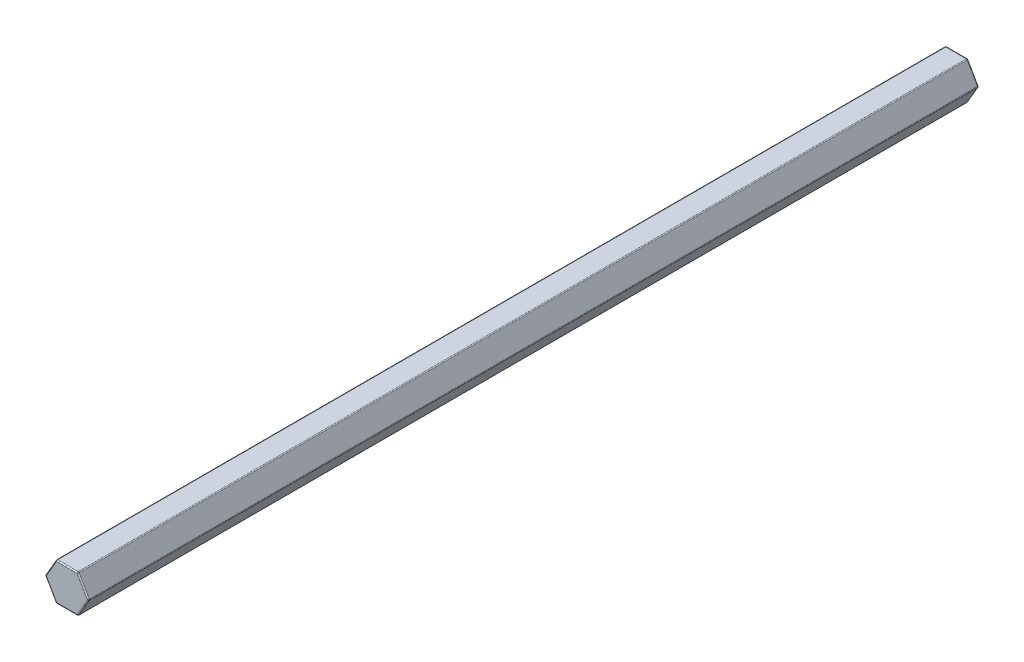
ISO-10303-21;
HEADER;
FILE_DESCRIPTION(('STEP AP214'),'2;1');
FILE_NAME('part.step','',(''),(''),'','','');
FILE_SCHEMA(('AUTOMOTIVE_DESIGN { 1 0 10303 214 1 1 1 1 }'));
ENDSEC;
DATA;
#1=APPLICATION_CONTEXT('core data for automotive mechanical design processes');
#2=APPLICATION_PROTOCOL_DEFINITION('international standard','automotive_design',2000,#1);
#3=PRODUCT_CONTEXT('',#1,'mechanical');
#4=PRODUCT('Part','Part','',(#3));
#5=PRODUCT_RELATED_PRODUCT_CATEGORY('part','',(#4));
#6=PRODUCT_DEFINITION_FORMATION('','',#4);
#7=PRODUCT_DEFINITION_CONTEXT('part definition',#1,'design');
#8=PRODUCT_DEFINITION('design','',#6,#7);
#9=PRODUCT_DEFINITION_SHAPE('','',#8);
#10=(LENGTH_UNIT() NAMED_UNIT(*) SI_UNIT(.MILLI.,.METRE.));
#11=(NAMED_UNIT(*) PLANE_ANGLE_UNIT() SI_UNIT($,.RADIAN.));
#12=(NAMED_UNIT(*) SI_UNIT($,.STERADIAN.) SOLID_ANGLE_UNIT());
#13=UNCERTAINTY_MEASURE_WITH_UNIT(LENGTH_MEASURE(1.E-05),#10,'distance_accuracy_value','');
#14=(GEOMETRIC_REPRESENTATION_CONTEXT(3) GLOBAL_UNCERTAINTY_ASSIGNED_CONTEXT((#13)) GLOBAL_UNIT_ASSIGNED_CONTEXT((#10,
#11,#12)) REPRESENTATION_CONTEXT('',''));
#15=CARTESIAN_POINT('',(0.,0.,0.));
#16=DIRECTION('',(0.,0.,1.));
#17=DIRECTION('',(1.,0.,0.));
#18=AXIS2_PLACEMENT_3D('',#15,#16,#17);
#19=CARTESIAN_POINT('',(1.8330871046771,-3.17499999999998,75.));
#20=DIRECTION('',(-0.866025403784441,0.499999999999995,0.));
#21=DIRECTION('',(-0.499999999999995,-0.866025403784441,0.));
#22=AXIS2_PLACEMENT_3D('',#19,#20,#21);
#23=PLANE('',#22);
#24=DIRECTION('',(0.,0.,-1.));
#25=VECTOR('',#24,1.);
#26=CARTESIAN_POINT('',(1.89082213159606,-3.07499999999998,75.));
#27=LINE('',#26,#25);
#28=CARTESIAN_POINT('',(1.89082213159606,-3.07499999999998,74.8));
#29=VERTEX_POINT('',#28);
#30=CARTESIAN_POINT('',(1.89082213159606,-3.07499999999998,-74.8));
#31=VERTEX_POINT('',#30);
#32=EDGE_CURVE('E314',#29,#31,#27,.T.);
#33=ORIENTED_EDGE('',*,*,#32,.T.);
#34=DIRECTION('',(0.499999999999995,0.866025403784441,0.));
#35=VECTOR('',#34,1.);
#36=CARTESIAN_POINT('',(1.8330871046771,-3.17499999999998,-74.8));
#37=LINE('',#36,#35);
#38=CARTESIAN_POINT('',(3.60843918243517,-0.1,-74.8));
#39=VERTEX_POINT('',#38);
#40=EDGE_CURVE('E317',#31,#39,#37,.T.);
#41=ORIENTED_EDGE('',*,*,#40,.T.);
#42=DIRECTION('',(0.,0.,-1.));
#43=VECTOR('',#42,1.);
#44=CARTESIAN_POINT('',(3.60843918243516,-0.1,75.));
#45=LINE('',#44,#43);
#46=CARTESIAN_POINT('',(3.60843918243517,-0.1,74.8));
#47=VERTEX_POINT('',#46);
#48=EDGE_CURVE('E312',#39,#47,#45,.F.);
#49=ORIENTED_EDGE('',*,*,#48,.T.);
#50=DIRECTION('',(0.499999999999995,0.866025403784441,0.));
#51=VECTOR('',#50,1.);
#52=CARTESIAN_POINT('',(1.8330871046771,-3.17499999999998,74.8));
#53=LINE('',#52,#51);
#54=EDGE_CURVE('E310',#47,#29,#53,.F.);
#55=ORIENTED_EDGE('',*,*,#54,.T.);
#56=EDGE_LOOP('',(#33,#41,#49,#55));
#57=FACE_BOUND('',#56,.T.);
#58=ADVANCED_FACE('F37',(#57),#23,.F.);
#59=CARTESIAN_POINT('',(3.66617420935413,0.,75.));
#60=DIRECTION('',(-0.866025403784438,-0.500000000000001,0.));
#61=DIRECTION('',(0.500000000000001,-0.866025403784438,0.));
#62=AXIS2_PLACEMENT_3D('',#59,#60,#61);
#63=PLANE('',#62);
#64=DIRECTION('',(0.,0.,-1.));
#65=VECTOR('',#64,1.);
#66=CARTESIAN_POINT('',(3.60843918243516,0.0999999999999989,75.));
#67=LINE('',#66,#65);
#68=CARTESIAN_POINT('',(3.60843918243516,0.0999999999999988,74.8));
#69=VERTEX_POINT('',#68);
#70=CARTESIAN_POINT('',(3.60843918243516,0.0999999999999989,-74.8));
#71=VERTEX_POINT('',#70);
#72=EDGE_CURVE('E171',#69,#71,#67,.T.);
#73=ORIENTED_EDGE('',*,*,#72,.T.);
#74=DIRECTION('',(-0.500000000000001,0.866025403784438,0.));
#75=VECTOR('',#74,1.);
#76=CARTESIAN_POINT('',(3.66617420935413,0.,-74.8));
#77=LINE('',#76,#75);
#78=CARTESIAN_POINT('',(1.89082213159602,3.07500000000001,-74.8));
#79=VERTEX_POINT('',#78);
#80=EDGE_CURVE('E167',#71,#79,#77,.T.);
#81=ORIENTED_EDGE('',*,*,#80,.T.);
#82=DIRECTION('',(0.,0.,-1.));
#83=VECTOR('',#82,1.);
#84=CARTESIAN_POINT('',(1.89082213159602,3.07500000000001,75.));
#85=LINE('',#84,#83);
#86=CARTESIAN_POINT('',(1.89082213159602,3.07500000000001,74.8));
#87=VERTEX_POINT('',#86);
#88=EDGE_CURVE('E161',#79,#87,#85,.F.);
#89=ORIENTED_EDGE('',*,*,#88,.T.);
#90=DIRECTION('',(-0.500000000000001,0.866025403784438,0.));
#91=VECTOR('',#90,1.);
#92=CARTESIAN_POINT('',(3.66617420935413,0.,74.8));
#93=LINE('',#92,#91);
#94=EDGE_CURVE('E164',#87,#69,#93,.F.);
#95=ORIENTED_EDGE('',*,*,#94,.T.);
#96=EDGE_LOOP('',(#73,#81,#89,#95));
#97=FACE_BOUND('',#96,.T.);
#98=ADVANCED_FACE('F163',(#97),#63,.F.);
#99=CARTESIAN_POINT('',(1.83308710467706,3.17500000000001,75.));
#100=DIRECTION('',(0.,-1.,0.));
#101=DIRECTION('',(1.,0.,0.));
#102=AXIS2_PLACEMENT_3D('',#99,#100,#101);
#103=PLANE('',#102);
#104=DIRECTION('',(0.,0.,-1.));
#105=VECTOR('',#104,1.);
#106=CARTESIAN_POINT('',(1.71761705083913,3.17500000000001,75.));
#107=LINE('',#106,#105);
#108=CARTESIAN_POINT('',(1.71761705083913,3.17500000000001,74.8));
#109=VERTEX_POINT('',#108);
#110=CARTESIAN_POINT('',(1.71761705083913,3.17500000000001,-74.8));
#111=VERTEX_POINT('',#110);
#112=EDGE_CURVE('E194',#109,#111,#107,.T.);
#113=ORIENTED_EDGE('',*,*,#112,.T.);
#114=DIRECTION('',(-1.,0.,0.));
#115=VECTOR('',#114,1.);
#116=CARTESIAN_POINT('',(1.83308710467706,3.17500000000001,-74.8));
#117=LINE('',#116,#115);
#118=CARTESIAN_POINT('',(-1.71761705083915,3.17499999999999,-74.8));
#119=VERTEX_POINT('',#118);
#120=EDGE_CURVE('E324',#111,#119,#117,.T.);
#121=ORIENTED_EDGE('',*,*,#120,.T.);
#122=DIRECTION('',(0.,0.,-1.));
#123=VECTOR('',#122,1.);
#124=CARTESIAN_POINT('',(-1.71761705083915,3.17499999999999,75.));
#125=LINE('',#124,#123);
#126=CARTESIAN_POINT('',(-1.71761705083915,3.17499999999999,74.8));
#127=VERTEX_POINT('',#126);
#128=EDGE_CURVE('E321',#119,#127,#125,.F.);
#129=ORIENTED_EDGE('',*,*,#128,.T.);
#130=DIRECTION('',(-1.,0.,0.));
#131=VECTOR('',#130,1.);
#132=CARTESIAN_POINT('',(1.83308710467706,3.17500000000001,74.8));
#133=LINE('',#132,#131);
#134=EDGE_CURVE('E319',#127,#109,#133,.F.);
#135=ORIENTED_EDGE('',*,*,#134,.T.);
#136=EDGE_LOOP('',(#113,#121,#129,#135));
#137=FACE_BOUND('',#136,.T.);
#138=ADVANCED_FACE('F443',(#137),#103,.F.);
#139=CARTESIAN_POINT('',(-1.83308710467708,3.17499999999999,75.));
#140=DIRECTION('',(0.866025403784442,-0.499999999999995,0.));
#141=DIRECTION('',(0.499999999999995,0.866025403784442,0.));
#142=AXIS2_PLACEMENT_3D('',#139,#140,#141);
#143=PLANE('',#142);
#144=DIRECTION('',(0.,0.,-1.));
#145=VECTOR('',#144,1.);
#146=CARTESIAN_POINT('',(-1.89082213159604,3.07499999999999,75.));
#147=LINE('',#146,#145);
#148=CARTESIAN_POINT('',(-1.89082213159604,3.07499999999999,74.8));
#149=VERTEX_POINT('',#148);
#150=CARTESIAN_POINT('',(-1.89082213159604,3.07499999999999,-74.8));
#151=VERTEX_POINT('',#150);
#152=EDGE_CURVE('E379',#149,#151,#147,.T.);
#153=ORIENTED_EDGE('',*,*,#152,.T.);
#154=DIRECTION('',(-0.499999999999995,-0.866025403784442,0.));
#155=VECTOR('',#154,1.);
#156=CARTESIAN_POINT('',(-1.83308710467708,3.17499999999999,-74.8));
#157=LINE('',#156,#155);
#158=CARTESIAN_POINT('',(-3.60843918243516,0.0999999999999749,-74.8));
#159=VERTEX_POINT('',#158);
#160=EDGE_CURVE('E383',#151,#159,#157,.T.);
#161=ORIENTED_EDGE('',*,*,#160,.T.);
#162=DIRECTION('',(0.,0.,-1.));
#163=VECTOR('',#162,1.);
#164=CARTESIAN_POINT('',(-3.60843918243516,0.0999999999999751,75.));
#165=LINE('',#164,#163);
#166=CARTESIAN_POINT('',(-3.60843918243516,0.0999999999999749,74.8));
#167=VERTEX_POINT('',#166);
#168=EDGE_CURVE('E381',#159,#167,#165,.F.);
#169=ORIENTED_EDGE('',*,*,#168,.T.);
#170=DIRECTION('',(-0.499999999999995,-0.866025403784442,0.));
#171=VECTOR('',#170,1.);
#172=CARTESIAN_POINT('',(-1.83308710467708,3.17499999999999,74.8));
#173=LINE('',#172,#171);
#174=EDGE_CURVE('E377',#167,#149,#173,.F.);
#175=ORIENTED_EDGE('',*,*,#174,.T.);
#176=EDGE_LOOP('',(#153,#161,#169,#175));
#177=FACE_BOUND('',#176,.T.);
#178=ADVANCED_FACE('F513',(#177),#143,.F.);
#179=CARTESIAN_POINT('',(-3.66617420935413,0.,75.));
#180=DIRECTION('',(0.866025403784434,0.500000000000007,0.));
#181=DIRECTION('',(-0.500000000000007,0.866025403784435,0.));
#182=AXIS2_PLACEMENT_3D('',#179,#180,#181);
#183=PLANE('',#182);
#184=DIRECTION('',(0.,0.,-1.));
#185=VECTOR('',#184,1.);
#186=CARTESIAN_POINT('',(-3.60843918243516,-0.100000000000026,75.));
#187=LINE('',#186,#185);
#188=CARTESIAN_POINT('',(-3.60843918243516,-0.100000000000026,74.8));
#189=VERTEX_POINT('',#188);
#190=CARTESIAN_POINT('',(-3.60843918243516,-0.100000000000026,-74.8));
#191=VERTEX_POINT('',#190);
#192=EDGE_CURVE('E305',#189,#191,#187,.T.);
#193=ORIENTED_EDGE('',*,*,#192,.T.);
#194=DIRECTION('',(0.500000000000007,-0.866025403784435,0.));
#195=VECTOR('',#194,1.);
#196=CARTESIAN_POINT('',(-3.66617420935413,0.,-74.8));
#197=LINE('',#196,#195);
#198=CARTESIAN_POINT('',(-1.890822131596,-3.07500000000002,-74.8));
#199=VERTEX_POINT('',#198);
#200=EDGE_CURVE('E308',#191,#199,#197,.T.);
#201=ORIENTED_EDGE('',*,*,#200,.T.);
#202=DIRECTION('',(0.,0.,-1.));
#203=VECTOR('',#202,1.);
#204=CARTESIAN_POINT('',(-1.890822131596,-3.07500000000002,75.));
#205=LINE('',#204,#203);
#206=CARTESIAN_POINT('',(-1.890822131596,-3.07500000000002,74.8));
#207=VERTEX_POINT('',#206);
#208=EDGE_CURVE('E288',#199,#207,#205,.F.);
#209=ORIENTED_EDGE('',*,*,#208,.T.);
#210=DIRECTION('',(0.500000000000007,-0.866025403784435,0.));
#211=VECTOR('',#210,1.);
#212=CARTESIAN_POINT('',(-3.66617420935413,0.,74.8));
#213=LINE('',#212,#211);
#214=EDGE_CURVE('E297',#207,#189,#213,.F.);
#215=ORIENTED_EDGE('',*,*,#214,.T.);
#216=EDGE_LOOP('',(#193,#201,#209,#215));
#217=FACE_BOUND('',#216,.T.);
#218=ADVANCED_FACE('F552',(#217),#183,.F.);
#219=CARTESIAN_POINT('',(-1.83308710467703,-3.17500000000002,75.));
#220=DIRECTION('',(0.,1.,0.));
#221=DIRECTION('',(-1.,0.,0.));
#222=AXIS2_PLACEMENT_3D('',#219,#220,#221);
#223=PLANE('',#222);
#224=DIRECTION('',(0.,0.,-1.));
#225=VECTOR('',#224,1.);
#226=CARTESIAN_POINT('',(-1.71761705083911,-3.17500000000002,75.));
#227=LINE('',#226,#225);
#228=CARTESIAN_POINT('',(-1.71761705083911,-3.17500000000002,74.8));
#229=VERTEX_POINT('',#228);
#230=CARTESIAN_POINT('',(-1.71761705083911,-3.17500000000002,-74.8));
#231=VERTEX_POINT('',#230);
#232=EDGE_CURVE('E290',#229,#231,#227,.T.);
#233=ORIENTED_EDGE('',*,*,#232,.T.);
#234=DIRECTION('',(1.,0.,0.));
#235=VECTOR('',#234,1.);
#236=CARTESIAN_POINT('',(-1.83308710467703,-3.17500000000002,-74.8));
#237=LINE('',#236,#235);
#238=CARTESIAN_POINT('',(1.71761705083918,-3.17499999999998,-74.8));
#239=VERTEX_POINT('',#238);
#240=EDGE_CURVE('E294',#231,#239,#237,.T.);
#241=ORIENTED_EDGE('',*,*,#240,.T.);
#242=DIRECTION('',(0.,0.,-1.));
#243=VECTOR('',#242,1.);
#244=CARTESIAN_POINT('',(1.71761705083918,-3.17499999999998,75.));
#245=LINE('',#244,#243);
#246=CARTESIAN_POINT('',(1.71761705083918,-3.17499999999998,74.8));
#247=VERTEX_POINT('',#246);
#248=EDGE_CURVE('E295',#239,#247,#245,.F.);
#249=ORIENTED_EDGE('',*,*,#248,.T.);
#250=DIRECTION('',(1.,0.,0.));
#251=VECTOR('',#250,1.);
#252=CARTESIAN_POINT('',(-1.83308710467703,-3.17500000000002,74.8));
#253=LINE('',#252,#251);
#254=EDGE_CURVE('E299',#247,#229,#253,.F.);
#255=ORIENTED_EDGE('',*,*,#254,.T.);
#256=EDGE_LOOP('',(#233,#241,#249,#255));
#257=FACE_BOUND('',#256,.T.);
#258=ADVANCED_FACE('F386',(#257),#223,.F.);
#259=CARTESIAN_POINT('',(0.,0.,75.));
#260=DIRECTION('',(0.,0.,1.));
#261=DIRECTION('',(1.,0.,0.));
#262=AXIS2_PLACEMENT_3D('',#259,#260,#261);
#263=PLANE('',#262);
#264=DIRECTION('',(0.500000000000007,-0.866025403784435,0.));
#265=VECTOR('',#264,1.);
#266=CARTESIAN_POINT('',(-1.65988202392015,-3.07500000000002,75.));
#267=LINE('',#266,#265);
#268=CARTESIAN_POINT('',(-3.43523410167828,0.,75.));
#269=VERTEX_POINT('',#268);
#270=CARTESIAN_POINT('',(-1.71761705083911,-2.97500000000002,75.));
#271=VERTEX_POINT('',#270);
#272=EDGE_CURVE('E46',#269,#271,#267,.T.);
#273=ORIENTED_EDGE('',*,*,#272,.T.);
#274=DIRECTION('',(1.,0.,0.));
#275=VECTOR('',#274,1.);
#276=CARTESIAN_POINT('',(1.8330871046771,-2.97499999999998,75.));
#277=LINE('',#276,#275);
#278=CARTESIAN_POINT('',(1.71761705083917,-2.97499999999998,75.));
#279=VERTEX_POINT('',#278);
#280=EDGE_CURVE('E11',#271,#279,#277,.T.);
#281=ORIENTED_EDGE('',*,*,#280,.T.);
#282=DIRECTION('',(0.499999999999995,0.866025403784441,0.));
#283=VECTOR('',#282,1.);
#284=CARTESIAN_POINT('',(3.49296912859724,0.0999999999999987,75.));
#285=LINE('',#284,#283);
#286=CARTESIAN_POINT('',(3.43523410167828,0.,75.));
#287=VERTEX_POINT('',#286);
#288=EDGE_CURVE('E326',#279,#287,#285,.T.);
#289=ORIENTED_EDGE('',*,*,#288,.T.);
#290=DIRECTION('',(-0.500000000000001,0.866025403784438,0.));
#291=VECTOR('',#290,1.);
#292=CARTESIAN_POINT('',(1.65988202392017,3.07500000000001,75.));
#293=LINE('',#292,#291);
#294=CARTESIAN_POINT('',(1.71761705083913,2.97500000000001,75.));
#295=VERTEX_POINT('',#294);
#296=EDGE_CURVE('E328',#287,#295,#293,.T.);
#297=ORIENTED_EDGE('',*,*,#296,.T.);
#298=DIRECTION('',(-1.,0.,0.));
#299=VECTOR('',#298,1.);
#300=CARTESIAN_POINT('',(-1.83308710467708,2.97499999999999,75.));
#301=LINE('',#300,#299);
#302=CARTESIAN_POINT('',(-1.71761705083915,2.97499999999999,75.));
#303=VERTEX_POINT('',#302);
#304=EDGE_CURVE('E330',#295,#303,#301,.T.);
#305=ORIENTED_EDGE('',*,*,#304,.T.);
#306=DIRECTION('',(-0.499999999999995,-0.866025403784442,0.));
#307=VECTOR('',#306,1.);
#308=CARTESIAN_POINT('',(-3.49296912859724,-0.100000000000025,75.));
#309=LINE('',#308,#307);
#310=EDGE_CURVE('E57',#303,#269,#309,.T.);
#311=ORIENTED_EDGE('',*,*,#310,.T.);
#312=EDGE_LOOP('',(#273,#281,#289,#297,#305,#311));
#313=FACE_BOUND('',#312,.T.);
#314=ADVANCED_FACE('F391',(#313),#263,.T.);
#315=CARTESIAN_POINT('',(0.,0.,-75.));
#316=DIRECTION('',(0.,0.,1.));
#317=DIRECTION('',(1.,0.,0.));
#318=AXIS2_PLACEMENT_3D('',#315,#316,#317);
#319=PLANE('',#318);
#320=DIRECTION('',(0.499999999999995,0.866025403784441,0.));
#321=VECTOR('',#320,1.);
#322=CARTESIAN_POINT('',(2.57642557625873,-1.48749999999999,-75.));
#323=LINE('',#322,#321);
#324=CARTESIAN_POINT('',(3.43523410167828,0.,-75.));
#325=VERTEX_POINT('',#324);
#326=CARTESIAN_POINT('',(1.71761705083917,-2.97499999999998,-75.));
#327=VERTEX_POINT('',#326);
#328=EDGE_CURVE('E353',#325,#327,#323,.F.);
#329=ORIENTED_EDGE('',*,*,#328,.T.);
#330=DIRECTION('',(1.,0.,0.));
#331=VECTOR('',#330,1.);
#332=CARTESIAN_POINT('',(0.,-2.975,-75.));
#333=LINE('',#332,#331);
#334=CARTESIAN_POINT('',(-1.71761705083911,-2.97500000000002,-75.));
#335=VERTEX_POINT('',#334);
#336=EDGE_CURVE('E375',#327,#335,#333,.F.);
#337=ORIENTED_EDGE('',*,*,#336,.T.);
#338=DIRECTION('',(0.500000000000007,-0.866025403784435,0.));
#339=VECTOR('',#338,1.);
#340=CARTESIAN_POINT('',(-2.57642557625869,-1.48750000000002,-75.));
#341=LINE('',#340,#339);
#342=CARTESIAN_POINT('',(-3.43523410167828,0.,-75.));
#343=VERTEX_POINT('',#342);
#344=EDGE_CURVE('E359',#335,#343,#341,.F.);
#345=ORIENTED_EDGE('',*,*,#344,.T.);
#346=DIRECTION('',(-0.499999999999995,-0.866025403784442,0.));
#347=VECTOR('',#346,1.);
#348=CARTESIAN_POINT('',(-2.57642557625871,1.48749999999998,-75.));
#349=LINE('',#348,#347);
#350=CARTESIAN_POINT('',(-1.71761705083915,2.97499999999999,-75.));
#351=VERTEX_POINT('',#350);
#352=EDGE_CURVE('E369',#343,#351,#349,.F.);
#353=ORIENTED_EDGE('',*,*,#352,.T.);
#354=DIRECTION('',(-1.,0.,0.));
#355=VECTOR('',#354,1.);
#356=CARTESIAN_POINT('',(0.,2.975,-75.));
#357=LINE('',#356,#355);
#358=CARTESIAN_POINT('',(1.71761705083913,2.97500000000001,-75.));
#359=VERTEX_POINT('',#358);
#360=EDGE_CURVE('E365',#351,#359,#357,.F.);
#361=ORIENTED_EDGE('',*,*,#360,.T.);
#362=DIRECTION('',(-0.500000000000001,0.866025403784438,0.));
#363=VECTOR('',#362,1.);
#364=CARTESIAN_POINT('',(2.5764255762587,1.4875,-75.));
#365=LINE('',#364,#363);
#366=EDGE_CURVE('E360',#359,#325,#365,.F.);
#367=ORIENTED_EDGE('',*,*,#366,.T.);
#368=EDGE_LOOP('',(#329,#337,#345,#353,#361,#367));
#369=FACE_BOUND('',#368,.T.);
#370=ADVANCED_FACE('F363',(#369),#319,.F.);
#371=CARTESIAN_POINT('',(-2.57642557625869,-1.48750000000002,74.8));
#372=DIRECTION('',(-0.500000000000007,0.866025403784435,0.));
#373=DIRECTION('',(-0.866025403784434,-0.500000000000007,0.));
#374=AXIS2_PLACEMENT_3D('',#371,#372,#373);
#375=CYLINDRICAL_SURFACE('',#374,0.2);
#376=CARTESIAN_POINT('',(-1.71761705083911,-2.97500000000002,74.8));
#377=DIRECTION('',(0.500000000000008,-0.866025403784434,0.));
#378=DIRECTION('',(0.866025403784434,0.500000000000008,0.));
#379=AXIS2_PLACEMENT_3D('',#376,#377,#378);
#380=CIRCLE('',#379,0.2);
#381=EDGE_CURVE('E41',#271,#207,#380,.T.);
#382=ORIENTED_EDGE('',*,*,#381,.F.);
#383=ORIENTED_EDGE('',*,*,#272,.F.);
#384=CARTESIAN_POINT('',(-3.43523410167828,0.,74.8));
#385=DIRECTION('',(-0.500000000000007,0.866025403784435,0.));
#386=DIRECTION('',(-0.866025403784434,-0.500000000000007,0.));
#387=AXIS2_PLACEMENT_3D('',#384,#385,#386);
#388=CIRCLE('',#387,0.2);
#389=EDGE_CURVE('E269',#189,#269,#388,.T.);
#390=ORIENTED_EDGE('',*,*,#389,.F.);
#391=ORIENTED_EDGE('',*,*,#214,.F.);
#392=EDGE_LOOP('',(#382,#383,#390,#391));
#393=FACE_BOUND('',#392,.T.);
#394=ADVANCED_FACE('F39',(#393),#375,.T.);
#395=CARTESIAN_POINT('',(-1.71761705083911,-2.97500000000002,74.8));
#396=DIRECTION('',(0.,0.,1.));
#397=DIRECTION('',(1.,0.,0.));
#398=AXIS2_PLACEMENT_3D('',#395,#396,#397);
#399=SPHERICAL_SURFACE('',#398,0.2);
#400=CARTESIAN_POINT('',(-1.71761705083911,-2.97500000000002,74.8));
#401=DIRECTION('',(-1.,0.,0.));
#402=DIRECTION('',(0.,-1.,0.));
#403=AXIS2_PLACEMENT_3D('',#400,#401,#402);
#404=CIRCLE('',#403,0.2);
#405=EDGE_CURVE('E264',#271,#229,#404,.F.);
#406=ORIENTED_EDGE('',*,*,#405,.F.);
#407=ORIENTED_EDGE('',*,*,#381,.T.);
#408=CARTESIAN_POINT('',(-1.71761705083911,-2.97500000000002,74.8));
#409=DIRECTION('',(0.,0.,1.));
#410=DIRECTION('',(1.,0.,0.));
#411=AXIS2_PLACEMENT_3D('',#408,#409,#410);
#412=CIRCLE('',#411,0.2);
#413=EDGE_CURVE('E267',#229,#207,#412,.F.);
#414=ORIENTED_EDGE('',*,*,#413,.F.);
#415=EDGE_LOOP('',(#406,#407,#414));
#416=FACE_BOUND('',#415,.T.);
#417=ADVANCED_FACE('F279',(#416),#399,.T.);
#418=CARTESIAN_POINT('',(-3.43523410167828,0.,74.8));
#419=DIRECTION('',(0.,0.,1.));
#420=DIRECTION('',(0.,-1.,0.));
#421=AXIS2_PLACEMENT_3D('',#418,#419,#420);
#422=SPHERICAL_SURFACE('',#421,0.2);
#423=CARTESIAN_POINT('',(-3.43523410167828,0.,74.8));
#424=DIRECTION('',(0.,0.,1.));
#425=DIRECTION('',(1.,0.,0.));
#426=AXIS2_PLACEMENT_3D('',#423,#424,#425);
#427=CIRCLE('',#426,0.2);
#428=EDGE_CURVE('E258',#189,#167,#427,.F.);
#429=ORIENTED_EDGE('',*,*,#428,.F.);
#430=ORIENTED_EDGE('',*,*,#389,.T.);
#431=CARTESIAN_POINT('',(-3.43523410167828,0.,74.8));
#432=DIRECTION('',(-0.499999999999996,-0.866025403784441,0.));
#433=DIRECTION('',(0.866025403784441,-0.499999999999996,0.));
#434=AXIS2_PLACEMENT_3D('',#431,#432,#433);
#435=CIRCLE('',#434,0.2);
#436=EDGE_CURVE('E261',#167,#269,#435,.F.);
#437=ORIENTED_EDGE('',*,*,#436,.F.);
#438=EDGE_LOOP('',(#429,#430,#437));
#439=FACE_BOUND('',#438,.T.);
#440=ADVANCED_FACE('F522',(#439),#422,.T.);
#441=CARTESIAN_POINT('',(-1.71761705083911,-2.97500000000002,75.));
#442=DIRECTION('',(0.,0.,-1.));
#443=DIRECTION('',(-1.,0.,0.));
#444=AXIS2_PLACEMENT_3D('',#441,#442,#443);
#445=CYLINDRICAL_SURFACE('',#444,0.2);
#446=ORIENTED_EDGE('',*,*,#413,.T.);
#447=ORIENTED_EDGE('',*,*,#208,.F.);
#448=CARTESIAN_POINT('',(-1.71761705083911,-2.97500000000002,-74.8));
#449=DIRECTION('',(0.,0.,-1.));
#450=DIRECTION('',(-1.,0.,0.));
#451=AXIS2_PLACEMENT_3D('',#448,#449,#450);
#452=CIRCLE('',#451,0.2);
#453=EDGE_CURVE('E252',#231,#199,#452,.T.);
#454=ORIENTED_EDGE('',*,*,#453,.F.);
#455=ORIENTED_EDGE('',*,*,#232,.F.);
#456=EDGE_LOOP('',(#446,#447,#454,#455));
#457=FACE_BOUND('',#456,.T.);
#458=ADVANCED_FACE('F286',(#457),#445,.T.);
#459=CARTESIAN_POINT('',(0.,-2.975,74.8));
#460=DIRECTION('',(-1.,0.,0.));
#461=DIRECTION('',(0.,-1.,0.));
#462=AXIS2_PLACEMENT_3D('',#459,#460,#461);
#463=CYLINDRICAL_SURFACE('',#462,0.2);
#464=ORIENTED_EDGE('',*,*,#405,.T.);
#465=ORIENTED_EDGE('',*,*,#254,.F.);
#466=CARTESIAN_POINT('',(1.71761705083917,-2.97499999999998,74.8));
#467=DIRECTION('',(1.,0.,0.));
#468=DIRECTION('',(0.,1.,0.));
#469=AXIS2_PLACEMENT_3D('',#466,#467,#468);
#470=CIRCLE('',#469,0.2);
#471=EDGE_CURVE('E249',#279,#247,#470,.T.);
#472=ORIENTED_EDGE('',*,*,#471,.F.);
#473=ORIENTED_EDGE('',*,*,#280,.F.);
#474=EDGE_LOOP('',(#464,#465,#472,#473));
#475=FACE_BOUND('',#474,.T.);
#476=ADVANCED_FACE('F390',(#475),#463,.T.);
#477=CARTESIAN_POINT('',(-2.57642557625871,1.48749999999998,74.8));
#478=DIRECTION('',(0.499999999999995,0.866025403784442,0.));
#479=DIRECTION('',(-0.866025403784442,0.499999999999995,0.));
#480=AXIS2_PLACEMENT_3D('',#477,#478,#479);
#481=CYLINDRICAL_SURFACE('',#480,0.2);
#482=ORIENTED_EDGE('',*,*,#436,.T.);
#483=ORIENTED_EDGE('',*,*,#310,.F.);
#484=CARTESIAN_POINT('',(-1.71761705083915,2.97499999999999,74.8));
#485=DIRECTION('',(0.499999999999995,0.866025403784442,0.));
#486=DIRECTION('',(-0.866025403784442,0.499999999999995,0.));
#487=AXIS2_PLACEMENT_3D('',#484,#485,#486);
#488=CIRCLE('',#487,0.2);
#489=EDGE_CURVE('E246',#149,#303,#488,.T.);
#490=ORIENTED_EDGE('',*,*,#489,.F.);
#491=ORIENTED_EDGE('',*,*,#174,.F.);
#492=EDGE_LOOP('',(#482,#483,#490,#491));
#493=FACE_BOUND('',#492,.T.);
#494=ADVANCED_FACE('F524',(#493),#481,.T.);
#495=CARTESIAN_POINT('',(-3.43523410167828,0.,75.));
#496=DIRECTION('',(0.,0.,-1.));
#497=DIRECTION('',(-1.,0.,0.));
#498=AXIS2_PLACEMENT_3D('',#495,#496,#497);
#499=CYLINDRICAL_SURFACE('',#498,0.2);
#500=ORIENTED_EDGE('',*,*,#428,.T.);
#501=ORIENTED_EDGE('',*,*,#168,.F.);
#502=CARTESIAN_POINT('',(-3.43523410167828,0.,-74.8));
#503=DIRECTION('',(0.,0.,-1.));
#504=DIRECTION('',(-1.,0.,0.));
#505=AXIS2_PLACEMENT_3D('',#502,#503,#504);
#506=CIRCLE('',#505,0.2);
#507=EDGE_CURVE('E243',#191,#159,#506,.T.);
#508=ORIENTED_EDGE('',*,*,#507,.F.);
#509=ORIENTED_EDGE('',*,*,#192,.F.);
#510=EDGE_LOOP('',(#500,#501,#508,#509));
#511=FACE_BOUND('',#510,.T.);
#512=ADVANCED_FACE('F436',(#511),#499,.T.);
#513=CARTESIAN_POINT('',(-3.49296912859724,0.0999999999999758,-74.8));
#514=DIRECTION('',(0.500000000000007,-0.866025403784435,0.));
#515=DIRECTION('',(0.866025403784434,0.500000000000007,0.));
#516=AXIS2_PLACEMENT_3D('',#513,#514,#515);
#517=CYLINDRICAL_SURFACE('',#516,0.2);
#518=CARTESIAN_POINT('',(-1.71761705083911,-2.97500000000002,-74.8));
#519=DIRECTION('',(0.500000000000008,-0.866025403784434,0.));
#520=DIRECTION('',(0.866025403784434,0.500000000000008,0.));
#521=AXIS2_PLACEMENT_3D('',#518,#519,#520);
#522=CIRCLE('',#521,0.2);
#523=EDGE_CURVE('E255',#199,#335,#522,.T.);
#524=ORIENTED_EDGE('',*,*,#523,.F.);
#525=ORIENTED_EDGE('',*,*,#200,.F.);
#526=CARTESIAN_POINT('',(-3.43523410167828,0.,-74.8));
#527=DIRECTION('',(-0.500000000000009,0.866025403784433,0.));
#528=DIRECTION('',(-0.866025403784433,-0.500000000000009,0.));
#529=AXIS2_PLACEMENT_3D('',#526,#527,#528);
#530=CIRCLE('',#529,0.2);
#531=EDGE_CURVE('E241',#343,#191,#530,.T.);
#532=ORIENTED_EDGE('',*,*,#531,.F.);
#533=ORIENTED_EDGE('',*,*,#344,.F.);
#534=EDGE_LOOP('',(#524,#525,#532,#533));
#535=FACE_BOUND('',#534,.T.);
#536=ADVANCED_FACE('F421',(#535),#517,.T.);
#537=CARTESIAN_POINT('',(-1.71761705083911,-2.97500000000002,-74.8));
#538=DIRECTION('',(0.,0.,-1.));
#539=DIRECTION('',(-1.,0.,0.));
#540=AXIS2_PLACEMENT_3D('',#537,#538,#539);
#541=SPHERICAL_SURFACE('',#540,0.2);
#542=ORIENTED_EDGE('',*,*,#453,.T.);
#543=ORIENTED_EDGE('',*,*,#523,.T.);
#544=CARTESIAN_POINT('',(-1.71761705083911,-2.97500000000002,-74.8));
#545=DIRECTION('',(-1.,0.,0.));
#546=DIRECTION('',(0.,-1.,0.));
#547=AXIS2_PLACEMENT_3D('',#544,#545,#546);
#548=CIRCLE('',#547,0.2);
#549=EDGE_CURVE('E238',#231,#335,#548,.F.);
#550=ORIENTED_EDGE('',*,*,#549,.F.);
#551=EDGE_LOOP('',(#542,#543,#550));
#552=FACE_BOUND('',#551,.T.);
#553=ADVANCED_FACE('F425',(#552),#541,.T.);
#554=CARTESIAN_POINT('',(1.71761705083917,-2.97499999999998,74.8));
#555=DIRECTION('',(0.,0.,1.));
#556=DIRECTION('',(1.,0.,0.));
#557=AXIS2_PLACEMENT_3D('',#554,#555,#556);
#558=SPHERICAL_SURFACE('',#557,0.2);
#559=CARTESIAN_POINT('',(1.71761705083917,-2.97499999999998,74.8));
#560=DIRECTION('',(-0.499999999999995,-0.866025403784441,0.));
#561=DIRECTION('',(0.866025403784442,-0.499999999999995,0.));
#562=AXIS2_PLACEMENT_3D('',#559,#560,#561);
#563=CIRCLE('',#562,0.2);
#564=EDGE_CURVE('E232',#279,#29,#563,.F.);
#565=ORIENTED_EDGE('',*,*,#564,.F.);
#566=ORIENTED_EDGE('',*,*,#471,.T.);
#567=CARTESIAN_POINT('',(1.71761705083917,-2.97499999999998,74.8));
#568=DIRECTION('',(0.,0.,1.));
#569=DIRECTION('',(1.,0.,0.));
#570=AXIS2_PLACEMENT_3D('',#567,#568,#569);
#571=CIRCLE('',#570,0.2);
#572=EDGE_CURVE('E235',#29,#247,#571,.F.);
#573=ORIENTED_EDGE('',*,*,#572,.F.);
#574=EDGE_LOOP('',(#565,#566,#573));
#575=FACE_BOUND('',#574,.T.);
#576=ADVANCED_FACE('F427',(#575),#558,.T.);
#577=CARTESIAN_POINT('',(-1.71761705083915,2.97499999999999,74.8));
#578=DIRECTION('',(0.,0.,1.));
#579=DIRECTION('',(1.,0.,0.));
#580=AXIS2_PLACEMENT_3D('',#577,#578,#579);
#581=SPHERICAL_SURFACE('',#580,0.2);
#582=CARTESIAN_POINT('',(-1.71761705083915,2.97499999999999,74.8));
#583=DIRECTION('',(0.,0.,1.));
#584=DIRECTION('',(1.,0.,0.));
#585=AXIS2_PLACEMENT_3D('',#582,#583,#584);
#586=CIRCLE('',#585,0.2);
#587=EDGE_CURVE('E226',#149,#127,#586,.F.);
#588=ORIENTED_EDGE('',*,*,#587,.F.);
#589=ORIENTED_EDGE('',*,*,#489,.T.);
#590=CARTESIAN_POINT('',(-1.71761705083915,2.97499999999999,74.8));
#591=DIRECTION('',(-1.,0.,0.));
#592=DIRECTION('',(0.,-1.,0.));
#593=AXIS2_PLACEMENT_3D('',#590,#591,#592);
#594=CIRCLE('',#593,0.2);
#595=EDGE_CURVE('E229',#127,#303,#594,.F.);
#596=ORIENTED_EDGE('',*,*,#595,.F.);
#597=EDGE_LOOP('',(#588,#589,#596));
#598=FACE_BOUND('',#597,.T.);
#599=ADVANCED_FACE('F433',(#598),#581,.T.);
#600=CARTESIAN_POINT('',(-3.43523410167828,0.,-74.8));
#601=DIRECTION('',(0.,0.,-1.));
#602=DIRECTION('',(-1.,0.,0.));
#603=AXIS2_PLACEMENT_3D('',#600,#601,#602);
#604=SPHERICAL_SURFACE('',#603,0.2);
#605=ORIENTED_EDGE('',*,*,#531,.T.);
#606=ORIENTED_EDGE('',*,*,#507,.T.);
#607=CARTESIAN_POINT('',(-3.43523410167828,0.,-74.8));
#608=DIRECTION('',(-0.499999999999995,-0.866025403784441,0.));
#609=DIRECTION('',(0.866025403784441,-0.499999999999995,0.));
#610=AXIS2_PLACEMENT_3D('',#607,#608,#609);
#611=CIRCLE('',#610,0.2);
#612=EDGE_CURVE('E224',#343,#159,#611,.F.);
#613=ORIENTED_EDGE('',*,*,#612,.F.);
#614=EDGE_LOOP('',(#605,#606,#613));
#615=FACE_BOUND('',#614,.T.);
#616=ADVANCED_FACE('F496',(#615),#604,.T.);
#617=CARTESIAN_POINT('',(-1.83308710467704,-2.97500000000002,-74.8));
#618=DIRECTION('',(1.,0.,0.));
#619=DIRECTION('',(0.,1.,0.));
#620=AXIS2_PLACEMENT_3D('',#617,#618,#619);
#621=CYLINDRICAL_SURFACE('',#620,0.2);
#622=ORIENTED_EDGE('',*,*,#549,.T.);
#623=ORIENTED_EDGE('',*,*,#336,.F.);
#624=CARTESIAN_POINT('',(1.71761705083917,-2.97499999999998,-74.8));
#625=DIRECTION('',(1.,0.,0.));
#626=DIRECTION('',(0.,1.,0.));
#627=AXIS2_PLACEMENT_3D('',#624,#625,#626);
#628=CIRCLE('',#627,0.2);
#629=EDGE_CURVE('E221',#239,#327,#628,.T.);
#630=ORIENTED_EDGE('',*,*,#629,.F.);
#631=ORIENTED_EDGE('',*,*,#240,.F.);
#632=EDGE_LOOP('',(#622,#623,#630,#631));
#633=FACE_BOUND('',#632,.T.);
#634=ADVANCED_FACE('F417',(#633),#621,.T.);
#635=CARTESIAN_POINT('',(1.71761705083917,-2.97499999999998,75.));
#636=DIRECTION('',(0.,0.,-1.));
#637=DIRECTION('',(-1.,0.,0.));
#638=AXIS2_PLACEMENT_3D('',#635,#636,#637);
#639=CYLINDRICAL_SURFACE('',#638,0.2);
#640=ORIENTED_EDGE('',*,*,#572,.T.);
#641=ORIENTED_EDGE('',*,*,#248,.F.);
#642=CARTESIAN_POINT('',(1.71761705083917,-2.97499999999998,-74.8));
#643=DIRECTION('',(0.,0.,-1.));
#644=DIRECTION('',(-1.,0.,0.));
#645=AXIS2_PLACEMENT_3D('',#642,#643,#644);
#646=CIRCLE('',#645,0.2);
#647=EDGE_CURVE('E219',#31,#239,#646,.T.);
#648=ORIENTED_EDGE('',*,*,#647,.F.);
#649=ORIENTED_EDGE('',*,*,#32,.F.);
#650=EDGE_LOOP('',(#640,#641,#648,#649));
#651=FACE_BOUND('',#650,.T.);
#652=ADVANCED_FACE('F413',(#651),#639,.T.);
#653=CARTESIAN_POINT('',(2.57642557625873,-1.48749999999999,74.8));
#654=DIRECTION('',(-0.499999999999995,-0.866025403784441,0.));
#655=DIRECTION('',(0.866025403784441,-0.499999999999995,0.));
#656=AXIS2_PLACEMENT_3D('',#653,#654,#655);
#657=CYLINDRICAL_SURFACE('',#656,0.2);
#658=ORIENTED_EDGE('',*,*,#564,.T.);
#659=ORIENTED_EDGE('',*,*,#54,.F.);
#660=CARTESIAN_POINT('',(3.43523410167828,0.,74.8));
#661=DIRECTION('',(0.499999999999993,0.866025403784442,0.));
#662=DIRECTION('',(-0.866025403784443,0.499999999999993,0.));
#663=AXIS2_PLACEMENT_3D('',#660,#661,#662);
#664=CIRCLE('',#663,0.2);
#665=EDGE_CURVE('E216',#287,#47,#664,.T.);
#666=ORIENTED_EDGE('',*,*,#665,.F.);
#667=ORIENTED_EDGE('',*,*,#288,.F.);
#668=EDGE_LOOP('',(#658,#659,#666,#667));
#669=FACE_BOUND('',#668,.T.);
#670=ADVANCED_FACE('F397',(#669),#657,.T.);
#671=CARTESIAN_POINT('',(2.5764255762587,1.4875,74.8));
#672=DIRECTION('',(0.500000000000001,-0.866025403784438,0.));
#673=DIRECTION('',(0.866025403784438,0.500000000000001,0.));
#674=AXIS2_PLACEMENT_3D('',#671,#672,#673);
#675=CYLINDRICAL_SURFACE('',#674,0.2);
#676=CARTESIAN_POINT('',(1.71761705083913,2.97500000000001,74.8));
#677=DIRECTION('',(-0.5,0.866025403784439,0.));
#678=DIRECTION('',(-0.866025403784439,-0.5,0.));
#679=AXIS2_PLACEMENT_3D('',#676,#677,#678);
#680=CIRCLE('',#679,0.2);
#681=EDGE_CURVE('E178',#295,#87,#680,.T.);
#682=ORIENTED_EDGE('',*,*,#681,.F.);
#683=ORIENTED_EDGE('',*,*,#296,.F.);
#684=CARTESIAN_POINT('',(3.43523410167828,0.,74.8));
#685=DIRECTION('',(0.500000000000001,-0.866025403784438,0.));
#686=DIRECTION('',(0.866025403784438,0.500000000000001,0.));
#687=AXIS2_PLACEMENT_3D('',#684,#685,#686);
#688=CIRCLE('',#687,0.2);
#689=EDGE_CURVE('E181',#69,#287,#688,.T.);
#690=ORIENTED_EDGE('',*,*,#689,.F.);
#691=ORIENTED_EDGE('',*,*,#94,.F.);
#692=EDGE_LOOP('',(#682,#683,#690,#691));
#693=FACE_BOUND('',#692,.T.);
#694=ADVANCED_FACE('F176',(#693),#675,.T.);
#695=CARTESIAN_POINT('',(0.,2.975,74.8));
#696=DIRECTION('',(1.,0.,0.));
#697=DIRECTION('',(0.,1.,0.));
#698=AXIS2_PLACEMENT_3D('',#695,#696,#697);
#699=CYLINDRICAL_SURFACE('',#698,0.2);
#700=ORIENTED_EDGE('',*,*,#595,.T.);
#701=ORIENTED_EDGE('',*,*,#304,.F.);
#702=CARTESIAN_POINT('',(1.71761705083913,2.97500000000001,74.8));
#703=DIRECTION('',(1.,0.,0.));
#704=DIRECTION('',(0.,1.,0.));
#705=AXIS2_PLACEMENT_3D('',#702,#703,#704);
#706=CIRCLE('',#705,0.2);
#707=EDGE_CURVE('E190',#109,#295,#706,.T.);
#708=ORIENTED_EDGE('',*,*,#707,.F.);
#709=ORIENTED_EDGE('',*,*,#134,.F.);
#710=EDGE_LOOP('',(#700,#701,#708,#709));
#711=FACE_BOUND('',#710,.T.);
#712=ADVANCED_FACE('F483',(#711),#699,.T.);
#713=CARTESIAN_POINT('',(-1.71761705083915,2.97499999999999,75.));
#714=DIRECTION('',(0.,0.,-1.));
#715=DIRECTION('',(-1.,0.,0.));
#716=AXIS2_PLACEMENT_3D('',#713,#714,#715);
#717=CYLINDRICAL_SURFACE('',#716,0.2);
#718=ORIENTED_EDGE('',*,*,#587,.T.);
#719=ORIENTED_EDGE('',*,*,#128,.F.);
#720=CARTESIAN_POINT('',(-1.71761705083915,2.97499999999999,-74.8));
#721=DIRECTION('',(0.,0.,-1.));
#722=DIRECTION('',(-1.,0.,0.));
#723=AXIS2_PLACEMENT_3D('',#720,#721,#722);
#724=CIRCLE('',#723,0.2);
#725=EDGE_CURVE('E211',#151,#119,#724,.T.);
#726=ORIENTED_EDGE('',*,*,#725,.F.);
#727=ORIENTED_EDGE('',*,*,#152,.F.);
#728=EDGE_LOOP('',(#718,#719,#726,#727));
#729=FACE_BOUND('',#728,.T.);
#730=ADVANCED_FACE('F479',(#729),#717,.T.);
#731=CARTESIAN_POINT('',(-1.65988202392019,3.075,-74.8));
#732=DIRECTION('',(-0.499999999999995,-0.866025403784442,0.));
#733=DIRECTION('',(0.866025403784442,-0.499999999999995,0.));
#734=AXIS2_PLACEMENT_3D('',#731,#732,#733);
#735=CYLINDRICAL_SURFACE('',#734,0.2);
#736=ORIENTED_EDGE('',*,*,#612,.T.);
#737=ORIENTED_EDGE('',*,*,#160,.F.);
#738=CARTESIAN_POINT('',(-1.71761705083915,2.97499999999999,-74.8));
#739=DIRECTION('',(0.499999999999995,0.866025403784441,0.));
#740=DIRECTION('',(-0.866025403784442,0.499999999999995,0.));
#741=AXIS2_PLACEMENT_3D('',#738,#739,#740);
#742=CIRCLE('',#741,0.2);
#743=EDGE_CURVE('E208',#351,#151,#742,.T.);
#744=ORIENTED_EDGE('',*,*,#743,.F.);
#745=ORIENTED_EDGE('',*,*,#352,.F.);
#746=EDGE_LOOP('',(#736,#737,#744,#745));
#747=FACE_BOUND('',#746,.T.);
#748=ADVANCED_FACE('F476',(#747),#735,.T.);
#749=CARTESIAN_POINT('',(1.71761705083917,-2.97499999999998,-74.8));
#750=DIRECTION('',(0.,0.,-1.));
#751=DIRECTION('',(-1.,0.,0.));
#752=AXIS2_PLACEMENT_3D('',#749,#750,#751);
#753=SPHERICAL_SURFACE('',#752,0.2);
#754=ORIENTED_EDGE('',*,*,#647,.T.);
#755=ORIENTED_EDGE('',*,*,#629,.T.);
#756=CARTESIAN_POINT('',(1.71761705083917,-2.97499999999998,-74.8));
#757=DIRECTION('',(-0.499999999999995,-0.866025403784441,0.));
#758=DIRECTION('',(0.866025403784442,-0.499999999999995,0.));
#759=AXIS2_PLACEMENT_3D('',#756,#757,#758);
#760=CIRCLE('',#759,0.2);
#761=EDGE_CURVE('E199',#31,#327,#760,.F.);
#762=ORIENTED_EDGE('',*,*,#761,.F.);
#763=EDGE_LOOP('',(#754,#755,#762));
#764=FACE_BOUND('',#763,.T.);
#765=ADVANCED_FACE('F410',(#764),#753,.T.);
#766=CARTESIAN_POINT('',(3.43523410167828,0.,74.8));
#767=DIRECTION('',(0.,0.,1.));
#768=DIRECTION('',(0.,-1.,0.));
#769=AXIS2_PLACEMENT_3D('',#766,#767,#768);
#770=SPHERICAL_SURFACE('',#769,0.2);
#771=ORIENTED_EDGE('',*,*,#689,.T.);
#772=ORIENTED_EDGE('',*,*,#665,.T.);
#773=CARTESIAN_POINT('',(3.43523410167828,0.,74.8));
#774=DIRECTION('',(0.,0.,1.));
#775=DIRECTION('',(1.,0.,0.));
#776=AXIS2_PLACEMENT_3D('',#773,#774,#775);
#777=CIRCLE('',#776,0.2);
#778=EDGE_CURVE('E195',#69,#47,#777,.F.);
#779=ORIENTED_EDGE('',*,*,#778,.F.);
#780=EDGE_LOOP('',(#771,#772,#779));
#781=FACE_BOUND('',#780,.T.);
#782=ADVANCED_FACE('F399',(#781),#770,.T.);
#783=CARTESIAN_POINT('',(1.71761705083913,2.97500000000001,74.8));
#784=DIRECTION('',(0.,0.,1.));
#785=DIRECTION('',(1.,0.,0.));
#786=AXIS2_PLACEMENT_3D('',#783,#784,#785);
#787=SPHERICAL_SURFACE('',#786,0.2);
#788=ORIENTED_EDGE('',*,*,#707,.T.);
#789=ORIENTED_EDGE('',*,*,#681,.T.);
#790=CARTESIAN_POINT('',(1.71761705083913,2.97500000000001,74.8));
#791=DIRECTION('',(0.,0.,1.));
#792=DIRECTION('',(1.,0.,0.));
#793=AXIS2_PLACEMENT_3D('',#790,#791,#792);
#794=CIRCLE('',#793,0.2);
#795=EDGE_CURVE('E187',#109,#87,#794,.F.);
#796=ORIENTED_EDGE('',*,*,#795,.F.);
#797=EDGE_LOOP('',(#788,#789,#796));
#798=FACE_BOUND('',#797,.T.);
#799=ADVANCED_FACE('F186',(#798),#787,.T.);
#800=CARTESIAN_POINT('',(-1.71761705083915,2.97499999999999,-74.8));
#801=DIRECTION('',(0.,0.,-1.));
#802=DIRECTION('',(-1.,0.,0.));
#803=AXIS2_PLACEMENT_3D('',#800,#801,#802);
#804=SPHERICAL_SURFACE('',#803,0.2);
#805=ORIENTED_EDGE('',*,*,#743,.T.);
#806=ORIENTED_EDGE('',*,*,#725,.T.);
#807=CARTESIAN_POINT('',(-1.71761705083915,2.97499999999999,-74.8));
#808=DIRECTION('',(-1.,0.,0.));
#809=DIRECTION('',(0.,-1.,0.));
#810=AXIS2_PLACEMENT_3D('',#807,#808,#809);
#811=CIRCLE('',#810,0.2);
#812=EDGE_CURVE('E196',#351,#119,#811,.F.);
#813=ORIENTED_EDGE('',*,*,#812,.F.);
#814=EDGE_LOOP('',(#805,#806,#813));
#815=FACE_BOUND('',#814,.T.);
#816=ADVANCED_FACE('F466',(#815),#804,.T.);
#817=CARTESIAN_POINT('',(1.65988202392021,-3.07499999999998,-74.8));
#818=DIRECTION('',(0.499999999999995,0.866025403784441,0.));
#819=DIRECTION('',(-0.866025403784441,0.499999999999995,0.));
#820=AXIS2_PLACEMENT_3D('',#817,#818,#819);
#821=CYLINDRICAL_SURFACE('',#820,0.2);
#822=ORIENTED_EDGE('',*,*,#761,.T.);
#823=ORIENTED_EDGE('',*,*,#328,.F.);
#824=CARTESIAN_POINT('',(3.43523410167828,0.,-74.8));
#825=DIRECTION('',(0.499999999999995,0.866025403784441,0.));
#826=DIRECTION('',(-0.866025403784441,0.499999999999995,0.));
#827=AXIS2_PLACEMENT_3D('',#824,#825,#826);
#828=CIRCLE('',#827,0.2);
#829=EDGE_CURVE('E202',#39,#325,#828,.T.);
#830=ORIENTED_EDGE('',*,*,#829,.F.);
#831=ORIENTED_EDGE('',*,*,#40,.F.);
#832=EDGE_LOOP('',(#822,#823,#830,#831));
#833=FACE_BOUND('',#832,.T.);
#834=ADVANCED_FACE('F355',(#833),#821,.T.);
#835=CARTESIAN_POINT('',(3.43523410167828,0.,75.));
#836=DIRECTION('',(0.,0.,-1.));
#837=DIRECTION('',(-1.,0.,0.));
#838=AXIS2_PLACEMENT_3D('',#835,#836,#837);
#839=CYLINDRICAL_SURFACE('',#838,0.2);
#840=ORIENTED_EDGE('',*,*,#778,.T.);
#841=ORIENTED_EDGE('',*,*,#48,.F.);
#842=CARTESIAN_POINT('',(3.43523410167828,0.,-74.8));
#843=DIRECTION('',(0.,0.,-1.));
#844=DIRECTION('',(-1.,0.,0.));
#845=AXIS2_PLACEMENT_3D('',#842,#843,#844);
#846=CIRCLE('',#845,0.2);
#847=EDGE_CURVE('E343',#71,#39,#846,.T.);
#848=ORIENTED_EDGE('',*,*,#847,.F.);
#849=ORIENTED_EDGE('',*,*,#72,.F.);
#850=EDGE_LOOP('',(#840,#841,#848,#849));
#851=FACE_BOUND('',#850,.T.);
#852=ADVANCED_FACE('F403',(#851),#839,.T.);
#853=CARTESIAN_POINT('',(1.71761705083913,2.97500000000001,75.));
#854=DIRECTION('',(0.,0.,-1.));
#855=DIRECTION('',(-1.,0.,0.));
#856=AXIS2_PLACEMENT_3D('',#853,#854,#855);
#857=CYLINDRICAL_SURFACE('',#856,0.2);
#858=ORIENTED_EDGE('',*,*,#795,.T.);
#859=ORIENTED_EDGE('',*,*,#88,.F.);
#860=CARTESIAN_POINT('',(1.71761705083913,2.97500000000001,-74.8));
#861=DIRECTION('',(0.,0.,-1.));
#862=DIRECTION('',(-1.,0.,0.));
#863=AXIS2_PLACEMENT_3D('',#860,#861,#862);
#864=CIRCLE('',#863,0.2);
#865=EDGE_CURVE('E340',#111,#79,#864,.T.);
#866=ORIENTED_EDGE('',*,*,#865,.F.);
#867=ORIENTED_EDGE('',*,*,#112,.F.);
#868=EDGE_LOOP('',(#858,#859,#866,#867));
#869=FACE_BOUND('',#868,.T.);
#870=ADVANCED_FACE('F192',(#869),#857,.T.);
#871=CARTESIAN_POINT('',(1.83308710467706,2.97500000000001,-74.8));
#872=DIRECTION('',(-1.,0.,0.));
#873=DIRECTION('',(0.,-1.,0.));
#874=AXIS2_PLACEMENT_3D('',#871,#872,#873);
#875=CYLINDRICAL_SURFACE('',#874,0.2);
#876=ORIENTED_EDGE('',*,*,#812,.T.);
#877=ORIENTED_EDGE('',*,*,#120,.F.);
#878=CARTESIAN_POINT('',(1.71761705083913,2.97500000000001,-74.8));
#879=DIRECTION('',(1.,0.,0.));
#880=DIRECTION('',(0.,1.,0.));
#881=AXIS2_PLACEMENT_3D('',#878,#879,#880);
#882=CIRCLE('',#881,0.2);
#883=EDGE_CURVE('E338',#359,#111,#882,.T.);
#884=ORIENTED_EDGE('',*,*,#883,.F.);
#885=ORIENTED_EDGE('',*,*,#360,.F.);
#886=EDGE_LOOP('',(#876,#877,#884,#885));
#887=FACE_BOUND('',#886,.T.);
#888=ADVANCED_FACE('F456',(#887),#875,.T.);
#889=CARTESIAN_POINT('',(3.43523410167828,0.,-74.8));
#890=DIRECTION('',(0.,0.,-1.));
#891=DIRECTION('',(0.,1.,0.));
#892=AXIS2_PLACEMENT_3D('',#889,#890,#891);
#893=SPHERICAL_SURFACE('',#892,0.2);
#894=ORIENTED_EDGE('',*,*,#847,.T.);
#895=ORIENTED_EDGE('',*,*,#829,.T.);
#896=CARTESIAN_POINT('',(3.43523410167828,0.,-74.8));
#897=DIRECTION('',(0.500000000000001,-0.866025403784438,0.));
#898=DIRECTION('',(0.866025403784438,0.500000000000001,0.));
#899=AXIS2_PLACEMENT_3D('',#896,#897,#898);
#900=CIRCLE('',#899,0.2);
#901=EDGE_CURVE('E336',#71,#325,#900,.F.);
#902=ORIENTED_EDGE('',*,*,#901,.F.);
#903=EDGE_LOOP('',(#894,#895,#902));
#904=FACE_BOUND('',#903,.T.);
#905=ADVANCED_FACE('F350',(#904),#893,.T.);
#906=CARTESIAN_POINT('',(1.71761705083913,2.97500000000001,-74.8));
#907=DIRECTION('',(0.,0.,-1.));
#908=DIRECTION('',(-1.,0.,0.));
#909=AXIS2_PLACEMENT_3D('',#906,#907,#908);
#910=SPHERICAL_SURFACE('',#909,0.2);
#911=ORIENTED_EDGE('',*,*,#883,.T.);
#912=ORIENTED_EDGE('',*,*,#865,.T.);
#913=CARTESIAN_POINT('',(1.71761705083913,2.97500000000001,-74.8));
#914=DIRECTION('',(-0.500000000000001,0.866025403784438,0.));
#915=DIRECTION('',(-0.866025403784438,-0.500000000000001,0.));
#916=AXIS2_PLACEMENT_3D('',#913,#914,#915);
#917=CIRCLE('',#916,0.2);
#918=EDGE_CURVE('E334',#359,#79,#917,.F.);
#919=ORIENTED_EDGE('',*,*,#918,.F.);
#920=EDGE_LOOP('',(#911,#912,#919));
#921=FACE_BOUND('',#920,.T.);
#922=ADVANCED_FACE('F450',(#921),#910,.T.);
#923=CARTESIAN_POINT('',(3.49296912859724,-0.1,-74.8));
#924=DIRECTION('',(-0.500000000000001,0.866025403784438,0.));
#925=DIRECTION('',(-0.866025403784438,-0.500000000000001,0.));
#926=AXIS2_PLACEMENT_3D('',#923,#924,#925);
#927=CYLINDRICAL_SURFACE('',#926,0.2);
#928=ORIENTED_EDGE('',*,*,#901,.T.);
#929=ORIENTED_EDGE('',*,*,#366,.F.);
#930=ORIENTED_EDGE('',*,*,#918,.T.);
#931=ORIENTED_EDGE('',*,*,#80,.F.);
#932=EDGE_LOOP('',(#928,#929,#930,#931));
#933=FACE_BOUND('',#932,.T.);
#934=ADVANCED_FACE('F447',(#933),#927,.T.);
#935=CLOSED_SHELL('',(#58,#98,#138,#178,#218,#258,#314,#370,#394,#417,#440,#458,#476,#494,#512,
#536,#553,#576,#599,#616,#634,#652,#670,#694,#712,#730,#748,#765,#782,#799,#816,#834,#852,#870,
#888,#905,#922,#934));
#936=MANIFOLD_SOLID_BREP('B2',#935);
#937=ADVANCED_BREP_SHAPE_REPRESENTATION('',(#18,#936),#14);
#938=SHAPE_DEFINITION_REPRESENTATION(#9,#937);
ENDSEC;
END-ISO-10303-21;
